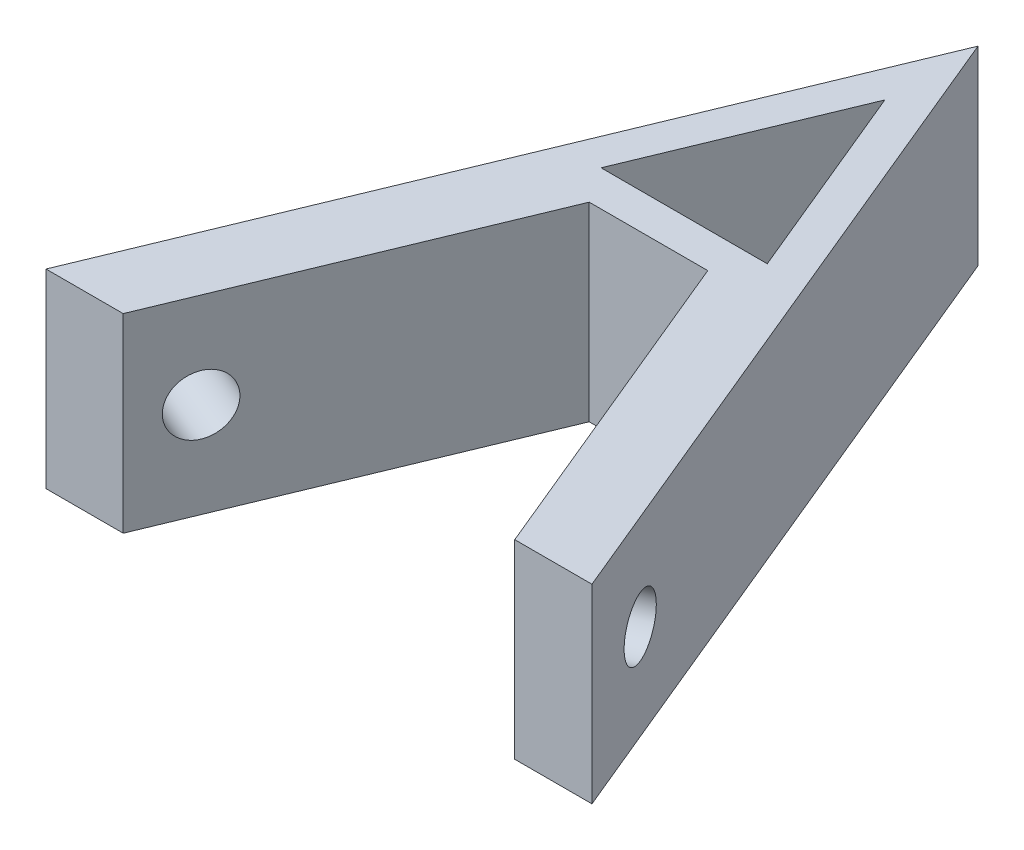
ISO-10303-21;
HEADER;
FILE_DESCRIPTION(('STEP AP214'),'2;1');
FILE_NAME('part.step','',(''),(''),'','','');
FILE_SCHEMA(('AUTOMOTIVE_DESIGN { 1 0 10303 214 1 1 1 1 }'));
ENDSEC;
DATA;
#1=APPLICATION_CONTEXT('core data for automotive mechanical design processes');
#2=APPLICATION_PROTOCOL_DEFINITION('international standard','automotive_design',2000,#1);
#3=PRODUCT_CONTEXT('',#1,'mechanical');
#4=PRODUCT('Part','Part','',(#3));
#5=PRODUCT_RELATED_PRODUCT_CATEGORY('part','',(#4));
#6=PRODUCT_DEFINITION_FORMATION('','',#4);
#7=PRODUCT_DEFINITION_CONTEXT('part definition',#1,'design');
#8=PRODUCT_DEFINITION('design','',#6,#7);
#9=PRODUCT_DEFINITION_SHAPE('','',#8);
#10=(LENGTH_UNIT() NAMED_UNIT(*) SI_UNIT(.MILLI.,.METRE.));
#11=(NAMED_UNIT(*) PLANE_ANGLE_UNIT() SI_UNIT($,.RADIAN.));
#12=(NAMED_UNIT(*) SI_UNIT($,.STERADIAN.) SOLID_ANGLE_UNIT());
#13=UNCERTAINTY_MEASURE_WITH_UNIT(LENGTH_MEASURE(1.E-05),#10,'distance_accuracy_value','');
#14=(GEOMETRIC_REPRESENTATION_CONTEXT(3) GLOBAL_UNCERTAINTY_ASSIGNED_CONTEXT((#13)) GLOBAL_UNIT_ASSIGNED_CONTEXT((#10,
#11,#12)) REPRESENTATION_CONTEXT('',''));
#15=CARTESIAN_POINT('',(0.,0.,0.));
#16=DIRECTION('',(0.,0.,1.));
#17=DIRECTION('',(1.,0.,0.));
#18=AXIS2_PLACEMENT_3D('',#15,#16,#17);
#19=CARTESIAN_POINT('',(-22.9610059419052,16.,55.4327719506773));
#20=DIRECTION('',(0.,0.,-1.));
#21=DIRECTION('',(-1.,0.,0.));
#22=AXIS2_PLACEMENT_3D('',#19,#20,#21);
#23=PLANE('',#22);
#24=DIRECTION('',(1.,0.,0.));
#25=VECTOR('',#24,1.);
#26=CARTESIAN_POINT('',(-22.9610059419052,0.,55.4327719506773));
#27=LINE('',#26,#25);
#28=CARTESIAN_POINT('',(-22.9610059419052,0.,55.4327719506773));
#29=VERTEX_POINT('',#28);
#30=CARTESIAN_POINT('',(-16.4666527401509,0.,55.4327719506773));
#31=VERTEX_POINT('',#30);
#32=EDGE_CURVE('E142',#29,#31,#27,.T.);
#33=ORIENTED_EDGE('',*,*,#32,.T.);
#34=DIRECTION('',(0.,1.,0.));
#35=VECTOR('',#34,1.);
#36=CARTESIAN_POINT('',(-16.4666527401509,0.,55.4327719506773));
#37=LINE('',#36,#35);
#38=CARTESIAN_POINT('',(-16.4666527401509,16.,55.4327719506773));
#39=VERTEX_POINT('',#38);
#40=EDGE_CURVE('E178',#31,#39,#37,.T.);
#41=ORIENTED_EDGE('',*,*,#40,.T.);
#42=DIRECTION('',(1.,0.,0.));
#43=VECTOR('',#42,1.);
#44=CARTESIAN_POINT('',(-22.9610059419052,16.,55.4327719506773));
#45=LINE('',#44,#43);
#46=CARTESIAN_POINT('',(-22.9610059419052,16.,55.4327719506773));
#47=VERTEX_POINT('',#46);
#48=EDGE_CURVE('E152',#47,#39,#45,.T.);
#49=ORIENTED_EDGE('',*,*,#48,.F.);
#50=DIRECTION('',(0.,-1.,0.));
#51=VECTOR('',#50,1.);
#52=CARTESIAN_POINT('',(-22.9610059419052,16.,55.4327719506773));
#53=LINE('',#52,#51);
#54=EDGE_CURVE('E47',#47,#29,#53,.T.);
#55=ORIENTED_EDGE('',*,*,#54,.T.);
#56=EDGE_LOOP('',(#33,#41,#49,#55));
#57=FACE_BOUND('',#56,.T.);
#58=ADVANCED_FACE('F38',(#57),#23,.F.);
#59=CARTESIAN_POINT('',(22.9610059419052,16.,55.4327719506773));
#60=DIRECTION('',(-0.923879532511288,0.,0.382683432365087));
#61=DIRECTION('',(0.382683432365087,0.,0.923879532511288));
#62=AXIS2_PLACEMENT_3D('',#59,#60,#61);
#63=PLANE('',#62);
#64=CARTESIAN_POINT('',(20.0908801991671,8.,48.5036754568426));
#65=DIRECTION('',(0.923879532511288,0.,-0.382683432365087));
#66=DIRECTION('',(-0.382683432365087,0.,-0.923879532511288));
#67=AXIS2_PLACEMENT_3D('',#64,#65,#66);
#68=CIRCLE('',#67,2.5);
#69=CARTESIAN_POINT('',(19.1341716182544,8.,46.1939766255644));
#70=VERTEX_POINT('',#69);
#71=EDGE_CURVE('E157',#70,#70,#68,.T.);
#72=ORIENTED_EDGE('',*,*,#71,.F.);
#73=EDGE_LOOP('',(#72));
#74=FACE_BOUND('',#73,.T.);
#75=DIRECTION('',(-0.382683432365087,0.,-0.923879532511288));
#76=VECTOR('',#75,1.);
#77=CARTESIAN_POINT('',(22.9610059419052,0.,55.4327719506773));
#78=LINE('',#77,#76);
#79=CARTESIAN_POINT('',(22.9610059419052,0.,55.4327719506773));
#80=VERTEX_POINT('',#79);
#81=CARTESIAN_POINT('',(0.,0.,0.));
#82=VERTEX_POINT('',#81);
#83=EDGE_CURVE('E141',#80,#82,#78,.T.);
#84=ORIENTED_EDGE('',*,*,#83,.T.);
#85=DIRECTION('',(0.,-1.,0.));
#86=VECTOR('',#85,1.);
#87=CARTESIAN_POINT('',(0.,16.,0.));
#88=LINE('',#87,#86);
#89=CARTESIAN_POINT('',(0.,16.,0.));
#90=VERTEX_POINT('',#89);
#91=EDGE_CURVE('E11',#90,#82,#88,.T.);
#92=ORIENTED_EDGE('',*,*,#91,.F.);
#93=DIRECTION('',(-0.382683432365087,0.,-0.923879532511288));
#94=VECTOR('',#93,1.);
#95=CARTESIAN_POINT('',(22.9610059419052,16.,55.4327719506773));
#96=LINE('',#95,#94);
#97=CARTESIAN_POINT('',(22.9610059419052,16.,55.4327719506773));
#98=VERTEX_POINT('',#97);
#99=EDGE_CURVE('E146',#98,#90,#96,.T.);
#100=ORIENTED_EDGE('',*,*,#99,.F.);
#101=DIRECTION('',(0.,-1.,0.));
#102=VECTOR('',#101,1.);
#103=CARTESIAN_POINT('',(22.9610059419052,16.,55.4327719506773));
#104=LINE('',#103,#102);
#105=EDGE_CURVE('E150',#98,#80,#104,.T.);
#106=ORIENTED_EDGE('',*,*,#105,.T.);
#107=EDGE_LOOP('',(#84,#92,#100,#106));
#108=FACE_BOUND('',#107,.T.);
#109=ADVANCED_FACE('F40',(#74,#108),#63,.F.);
#110=CARTESIAN_POINT('',(0.,16.,0.));
#111=DIRECTION('',(0.923879532511288,0.,0.382683432365087));
#112=DIRECTION('',(0.382683432365087,0.,-0.923879532511288));
#113=AXIS2_PLACEMENT_3D('',#110,#111,#112);
#114=PLANE('',#113);
#115=CARTESIAN_POINT('',(-20.0908801991671,8.,48.5036754568426));
#116=DIRECTION('',(-0.923879532511288,0.,-0.382683432365087));
#117=DIRECTION('',(-0.382683432365087,0.,0.923879532511288));
#118=AXIS2_PLACEMENT_3D('',#115,#116,#117);
#119=CIRCLE('',#118,2.5);
#120=CARTESIAN_POINT('',(-21.0475887800798,8.,50.8133742881208));
#121=VERTEX_POINT('',#120);
#122=EDGE_CURVE('E167',#121,#121,#119,.T.);
#123=ORIENTED_EDGE('',*,*,#122,.F.);
#124=EDGE_LOOP('',(#123));
#125=FACE_BOUND('',#124,.T.);
#126=DIRECTION('',(-0.382683432365087,0.,0.923879532511288));
#127=VECTOR('',#126,1.);
#128=CARTESIAN_POINT('',(0.,0.,0.));
#129=LINE('',#128,#127);
#130=EDGE_CURVE('E143',#82,#29,#129,.T.);
#131=ORIENTED_EDGE('',*,*,#130,.T.);
#132=ORIENTED_EDGE('',*,*,#54,.F.);
#133=DIRECTION('',(-0.382683432365087,0.,0.923879532511288));
#134=VECTOR('',#133,1.);
#135=CARTESIAN_POINT('',(0.,16.,0.));
#136=LINE('',#135,#134);
#137=EDGE_CURVE('E205',#90,#47,#136,.T.);
#138=ORIENTED_EDGE('',*,*,#137,.F.);
#139=ORIENTED_EDGE('',*,*,#91,.T.);
#140=EDGE_LOOP('',(#131,#132,#138,#139));
#141=FACE_BOUND('',#140,.T.);
#142=ADVANCED_FACE('F224',(#125,#141),#114,.F.);
#143=CARTESIAN_POINT('',(16.4666527401509,16.,55.4327719506773));
#144=VERTEX_POINT('',#143);
#145=EDGE_CURVE('E133',#144,#98,#45,.T.);
#146=ORIENTED_EDGE('',*,*,#145,.F.);
#147=DIRECTION('',(0.,1.,0.));
#148=VECTOR('',#147,1.);
#149=CARTESIAN_POINT('',(16.4666527401509,0.,55.4327719506773));
#150=LINE('',#149,#148);
#151=CARTESIAN_POINT('',(16.4666527401509,0.,55.4327719506773));
#152=VERTEX_POINT('',#151);
#153=EDGE_CURVE('E120',#152,#144,#150,.T.);
#154=ORIENTED_EDGE('',*,*,#153,.F.);
#155=EDGE_CURVE('E131',#152,#80,#27,.T.);
#156=ORIENTED_EDGE('',*,*,#155,.T.);
#157=ORIENTED_EDGE('',*,*,#105,.F.);
#158=EDGE_LOOP('',(#146,#154,#156,#157));
#159=FACE_BOUND('',#158,.T.);
#160=ADVANCED_FACE('F129',(#159),#23,.F.);
#161=CARTESIAN_POINT('',(0.,16.,0.));
#162=DIRECTION('',(0.,-1.,0.));
#163=DIRECTION('',(0.,0.,-1.));
#164=AXIS2_PLACEMENT_3D('',#161,#162,#163);
#165=PLANE('',#164);
#166=DIRECTION('',(1.,0.,0.));
#167=VECTOR('',#166,1.);
#168=CARTESIAN_POINT('',(-6.99068568295617,16.,24.7163859753386));
#169=LINE('',#168,#167);
#170=CARTESIAN_POINT('',(-6.99068568295617,16.,24.7163859753386));
#171=VERTEX_POINT('',#170);
#172=CARTESIAN_POINT('',(6.99068568295616,16.,24.7163859753386));
#173=VERTEX_POINT('',#172);
#174=EDGE_CURVE('E191',#171,#173,#169,.T.);
#175=ORIENTED_EDGE('',*,*,#174,.F.);
#176=DIRECTION('',(-0.382683432365087,0.,0.923879532511288));
#177=VECTOR('',#176,1.);
#178=CARTESIAN_POINT('',(0.,16.,7.83937778925831));
#179=LINE('',#178,#177);
#180=CARTESIAN_POINT('',(0.,16.,7.83937778925831));
#181=VERTEX_POINT('',#180);
#182=EDGE_CURVE('E55',#181,#171,#179,.T.);
#183=ORIENTED_EDGE('',*,*,#182,.F.);
#184=DIRECTION('',(-0.382683432365087,0.,-0.923879532511288));
#185=VECTOR('',#184,1.);
#186=CARTESIAN_POINT('',(6.99068568295616,16.,24.7163859753386));
#187=LINE('',#186,#185);
#188=EDGE_CURVE('E188',#173,#181,#187,.T.);
#189=ORIENTED_EDGE('',*,*,#188,.F.);
#190=EDGE_LOOP('',(#175,#183,#189));
#191=FACE_BOUND('',#190,.T.);
#192=ORIENTED_EDGE('',*,*,#48,.T.);
#193=DIRECTION('',(-0.382683432365087,0.,0.923879532511288));
#194=VECTOR('',#193,1.);
#195=CARTESIAN_POINT('',(-16.4666527401509,16.,55.4327719506773));
#196=LINE('',#195,#194);
#197=CARTESIAN_POINT('',(-4.98614976919826,16.,27.7163859753386));
#198=VERTEX_POINT('',#197);
#199=EDGE_CURVE('E125',#198,#39,#196,.T.);
#200=ORIENTED_EDGE('',*,*,#199,.F.);
#201=DIRECTION('',(-1.,0.,0.));
#202=VECTOR('',#201,1.);
#203=CARTESIAN_POINT('',(4.98614976919825,16.,27.7163859753386));
#204=LINE('',#203,#202);
#205=CARTESIAN_POINT('',(4.98614976919825,16.,27.7163859753386));
#206=VERTEX_POINT('',#205);
#207=EDGE_CURVE('E174',#206,#198,#204,.T.);
#208=ORIENTED_EDGE('',*,*,#207,.F.);
#209=DIRECTION('',(-0.382683432365087,0.,-0.923879532511288));
#210=VECTOR('',#209,1.);
#211=CARTESIAN_POINT('',(16.4666527401509,16.,55.4327719506773));
#212=LINE('',#211,#210);
#213=EDGE_CURVE('E172',#144,#206,#212,.T.);
#214=ORIENTED_EDGE('',*,*,#213,.F.);
#215=ORIENTED_EDGE('',*,*,#145,.T.);
#216=ORIENTED_EDGE('',*,*,#99,.T.);
#217=ORIENTED_EDGE('',*,*,#137,.T.);
#218=EDGE_LOOP('',(#192,#200,#208,#214,#215,#216,#217));
#219=FACE_BOUND('',#218,.T.);
#220=ADVANCED_FACE('F212',(#191,#219),#165,.F.);
#221=CARTESIAN_POINT('',(0.,0.,0.));
#222=DIRECTION('',(0.,-1.,0.));
#223=DIRECTION('',(0.,0.,-1.));
#224=AXIS2_PLACEMENT_3D('',#221,#222,#223);
#225=PLANE('',#224);
#226=DIRECTION('',(-0.382683432365087,0.,0.923879532511288));
#227=VECTOR('',#226,1.);
#228=CARTESIAN_POINT('',(-16.4666527401509,0.,55.4327719506773));
#229=LINE('',#228,#227);
#230=CARTESIAN_POINT('',(-4.98614976919826,0.,27.7163859753386));
#231=VERTEX_POINT('',#230);
#232=EDGE_CURVE('E134',#231,#31,#229,.T.);
#233=ORIENTED_EDGE('',*,*,#232,.T.);
#234=ORIENTED_EDGE('',*,*,#32,.F.);
#235=ORIENTED_EDGE('',*,*,#130,.F.);
#236=ORIENTED_EDGE('',*,*,#83,.F.);
#237=ORIENTED_EDGE('',*,*,#155,.F.);
#238=DIRECTION('',(-0.382683432365087,0.,-0.923879532511288));
#239=VECTOR('',#238,1.);
#240=CARTESIAN_POINT('',(16.4666527401509,0.,55.4327719506773));
#241=LINE('',#240,#239);
#242=CARTESIAN_POINT('',(4.98614976919825,0.,27.7163859753386));
#243=VERTEX_POINT('',#242);
#244=EDGE_CURVE('E116',#152,#243,#241,.T.);
#245=ORIENTED_EDGE('',*,*,#244,.T.);
#246=DIRECTION('',(-1.,0.,0.));
#247=VECTOR('',#246,1.);
#248=CARTESIAN_POINT('',(4.98614976919825,0.,27.7163859753386));
#249=LINE('',#248,#247);
#250=EDGE_CURVE('E63',#243,#231,#249,.T.);
#251=ORIENTED_EDGE('',*,*,#250,.T.);
#252=EDGE_LOOP('',(#233,#234,#235,#236,#237,#245,#251));
#253=FACE_BOUND('',#252,.T.);
#254=DIRECTION('',(-0.382683432365087,0.,0.923879532511288));
#255=VECTOR('',#254,1.);
#256=CARTESIAN_POINT('',(0.,0.,7.83937778925831));
#257=LINE('',#256,#255);
#258=CARTESIAN_POINT('',(0.,0.,7.83937778925831));
#259=VERTEX_POINT('',#258);
#260=CARTESIAN_POINT('',(-6.99068568295617,0.,24.7163859753386));
#261=VERTEX_POINT('',#260);
#262=EDGE_CURVE('E192',#259,#261,#257,.T.);
#263=ORIENTED_EDGE('',*,*,#262,.T.);
#264=DIRECTION('',(1.,0.,0.));
#265=VECTOR('',#264,1.);
#266=CARTESIAN_POINT('',(-6.99068568295617,0.,24.7163859753386));
#267=LINE('',#266,#265);
#268=CARTESIAN_POINT('',(6.99068568295616,0.,24.7163859753386));
#269=VERTEX_POINT('',#268);
#270=EDGE_CURVE('E198',#261,#269,#267,.T.);
#271=ORIENTED_EDGE('',*,*,#270,.T.);
#272=DIRECTION('',(-0.382683432365087,0.,-0.923879532511288));
#273=VECTOR('',#272,1.);
#274=CARTESIAN_POINT('',(6.99068568295616,0.,24.7163859753386));
#275=LINE('',#274,#273);
#276=EDGE_CURVE('E186',#269,#259,#275,.T.);
#277=ORIENTED_EDGE('',*,*,#276,.T.);
#278=EDGE_LOOP('',(#263,#271,#277));
#279=FACE_BOUND('',#278,.T.);
#280=ADVANCED_FACE('F138',(#253,#279),#225,.T.);
#281=CARTESIAN_POINT('',(0.,0.,7.83937778925831));
#282=DIRECTION('',(-0.923879532511288,0.,-0.382683432365087));
#283=DIRECTION('',(-0.382683432365087,0.,0.923879532511288));
#284=AXIS2_PLACEMENT_3D('',#281,#282,#283);
#285=PLANE('',#284);
#286=ORIENTED_EDGE('',*,*,#182,.T.);
#287=DIRECTION('',(0.,1.,0.));
#288=VECTOR('',#287,1.);
#289=CARTESIAN_POINT('',(-6.99068568295617,0.,24.7163859753386));
#290=LINE('',#289,#288);
#291=EDGE_CURVE('E184',#261,#171,#290,.T.);
#292=ORIENTED_EDGE('',*,*,#291,.F.);
#293=ORIENTED_EDGE('',*,*,#262,.F.);
#294=DIRECTION('',(0.,1.,0.));
#295=VECTOR('',#294,1.);
#296=CARTESIAN_POINT('',(0.,0.,7.83937778925831));
#297=LINE('',#296,#295);
#298=EDGE_CURVE('E156',#259,#181,#297,.T.);
#299=ORIENTED_EDGE('',*,*,#298,.T.);
#300=EDGE_LOOP('',(#286,#292,#293,#299));
#301=FACE_BOUND('',#300,.T.);
#302=ADVANCED_FACE('F240',(#301),#285,.F.);
#303=CARTESIAN_POINT('',(6.99068568295616,0.,24.7163859753386));
#304=DIRECTION('',(0.923879532511288,0.,-0.382683432365087));
#305=DIRECTION('',(-0.382683432365087,0.,-0.923879532511288));
#306=AXIS2_PLACEMENT_3D('',#303,#304,#305);
#307=PLANE('',#306);
#308=ORIENTED_EDGE('',*,*,#188,.T.);
#309=ORIENTED_EDGE('',*,*,#298,.F.);
#310=ORIENTED_EDGE('',*,*,#276,.F.);
#311=DIRECTION('',(0.,1.,0.));
#312=VECTOR('',#311,1.);
#313=CARTESIAN_POINT('',(6.99068568295616,0.,24.7163859753386));
#314=LINE('',#313,#312);
#315=EDGE_CURVE('E160',#269,#173,#314,.T.);
#316=ORIENTED_EDGE('',*,*,#315,.T.);
#317=EDGE_LOOP('',(#308,#309,#310,#316));
#318=FACE_BOUND('',#317,.T.);
#319=ADVANCED_FACE('F244',(#318),#307,.F.);
#320=CARTESIAN_POINT('',(-6.99068568295617,0.,24.7163859753386));
#321=DIRECTION('',(0.,0.,1.));
#322=DIRECTION('',(1.,0.,0.));
#323=AXIS2_PLACEMENT_3D('',#320,#321,#322);
#324=PLANE('',#323);
#325=ORIENTED_EDGE('',*,*,#174,.T.);
#326=ORIENTED_EDGE('',*,*,#315,.F.);
#327=ORIENTED_EDGE('',*,*,#270,.F.);
#328=ORIENTED_EDGE('',*,*,#291,.T.);
#329=EDGE_LOOP('',(#325,#326,#327,#328));
#330=FACE_BOUND('',#329,.T.);
#331=ADVANCED_FACE('F247',(#330),#324,.F.);
#332=CARTESIAN_POINT('',(-16.4666527401509,0.,55.4327719506773));
#333=DIRECTION('',(-0.923879532511288,0.,-0.382683432365087));
#334=DIRECTION('',(-0.382683432365087,0.,0.923879532511288));
#335=AXIS2_PLACEMENT_3D('',#332,#333,#334);
#336=PLANE('',#335);
#337=CARTESIAN_POINT('',(-14.5476030040994,8.,50.7997760510331));
#338=DIRECTION('',(-0.923879532511288,0.,-0.382683432365087));
#339=DIRECTION('',(-0.382683432365087,0.,0.923879532511288));
#340=AXIS2_PLACEMENT_3D('',#337,#338,#339);
#341=CIRCLE('',#340,2.5);
#342=CARTESIAN_POINT('',(-15.5043115850121,8.,53.1094748823114));
#343=VERTEX_POINT('',#342);
#344=EDGE_CURVE('E42',#343,#343,#341,.T.);
#345=ORIENTED_EDGE('',*,*,#344,.T.);
#346=EDGE_LOOP('',(#345));
#347=FACE_BOUND('',#346,.T.);
#348=ORIENTED_EDGE('',*,*,#199,.T.);
#349=ORIENTED_EDGE('',*,*,#40,.F.);
#350=ORIENTED_EDGE('',*,*,#232,.F.);
#351=DIRECTION('',(0.,1.,0.));
#352=VECTOR('',#351,1.);
#353=CARTESIAN_POINT('',(-4.98614976919826,0.,27.7163859753386));
#354=LINE('',#353,#352);
#355=EDGE_CURVE('E181',#231,#198,#354,.T.);
#356=ORIENTED_EDGE('',*,*,#355,.T.);
#357=EDGE_LOOP('',(#348,#349,#350,#356));
#358=FACE_BOUND('',#357,.T.);
#359=ADVANCED_FACE('F219',(#347,#358),#336,.F.);
#360=CARTESIAN_POINT('',(4.98614976919825,0.,27.7163859753386));
#361=DIRECTION('',(0.,0.,-1.));
#362=DIRECTION('',(-1.,0.,0.));
#363=AXIS2_PLACEMENT_3D('',#360,#361,#362);
#364=PLANE('',#363);
#365=ORIENTED_EDGE('',*,*,#207,.T.);
#366=ORIENTED_EDGE('',*,*,#355,.F.);
#367=ORIENTED_EDGE('',*,*,#250,.F.);
#368=DIRECTION('',(0.,1.,0.));
#369=VECTOR('',#368,1.);
#370=CARTESIAN_POINT('',(4.98614976919825,0.,27.7163859753386));
#371=LINE('',#370,#369);
#372=EDGE_CURVE('E122',#243,#206,#371,.T.);
#373=ORIENTED_EDGE('',*,*,#372,.T.);
#374=EDGE_LOOP('',(#365,#366,#367,#373));
#375=FACE_BOUND('',#374,.T.);
#376=ADVANCED_FACE('F216',(#375),#364,.F.);
#377=CARTESIAN_POINT('',(16.4666527401509,0.,55.4327719506773));
#378=DIRECTION('',(0.923879532511288,0.,-0.382683432365087));
#379=DIRECTION('',(-0.382683432365087,0.,-0.923879532511288));
#380=AXIS2_PLACEMENT_3D('',#377,#378,#379);
#381=PLANE('',#380);
#382=CARTESIAN_POINT('',(14.5476030040994,8.,50.7997760510331));
#383=DIRECTION('',(0.923879532511288,0.,-0.382683432365087));
#384=DIRECTION('',(-0.382683432365087,0.,-0.923879532511288));
#385=AXIS2_PLACEMENT_3D('',#382,#383,#384);
#386=CIRCLE('',#385,2.5);
#387=CARTESIAN_POINT('',(13.5908944231866,8.,48.4900772197549));
#388=VERTEX_POINT('',#387);
#389=EDGE_CURVE('E154',#388,#388,#386,.T.);
#390=ORIENTED_EDGE('',*,*,#389,.T.);
#391=EDGE_LOOP('',(#390));
#392=FACE_BOUND('',#391,.T.);
#393=ORIENTED_EDGE('',*,*,#213,.T.);
#394=ORIENTED_EDGE('',*,*,#372,.F.);
#395=ORIENTED_EDGE('',*,*,#244,.F.);
#396=ORIENTED_EDGE('',*,*,#153,.T.);
#397=EDGE_LOOP('',(#393,#394,#395,#396));
#398=FACE_BOUND('',#397,.T.);
#399=ADVANCED_FACE('F119',(#392,#398),#381,.F.);
#400=CARTESIAN_POINT('',(5.30880767898648,8.,54.626610374684));
#401=DIRECTION('',(0.923879532511288,0.,-0.382683432365087));
#402=DIRECTION('',(-0.382683432365087,0.,-0.923879532511288));
#403=AXIS2_PLACEMENT_3D('',#400,#401,#402);
#404=CYLINDRICAL_SURFACE('',#403,2.5);
#405=ORIENTED_EDGE('',*,*,#71,.T.);
#406=EDGE_LOOP('',(#405));
#407=FACE_BOUND('',#406,.T.);
#408=ORIENTED_EDGE('',*,*,#389,.F.);
#409=EDGE_LOOP('',(#408));
#410=FACE_BOUND('',#409,.T.);
#411=ADVANCED_FACE('F256',(#407,#410),#404,.F.);
#412=CARTESIAN_POINT('',(-5.30880767898648,8.,54.626610374684));
#413=DIRECTION('',(-0.923879532511288,0.,-0.382683432365087));
#414=DIRECTION('',(-0.382683432365087,0.,0.923879532511288));
#415=AXIS2_PLACEMENT_3D('',#412,#413,#414);
#416=CYLINDRICAL_SURFACE('',#415,2.5);
#417=ORIENTED_EDGE('',*,*,#122,.T.);
#418=EDGE_LOOP('',(#417));
#419=FACE_BOUND('',#418,.T.);
#420=ORIENTED_EDGE('',*,*,#344,.F.);
#421=EDGE_LOOP('',(#420));
#422=FACE_BOUND('',#421,.T.);
#423=ADVANCED_FACE('F264',(#419,#422),#416,.F.);
#424=CLOSED_SHELL('',(#58,#109,#142,#160,#220,#280,#302,#319,#331,#359,#376,#399,#411,#423));
#425=MANIFOLD_SOLID_BREP('B2',#424);
#426=ADVANCED_BREP_SHAPE_REPRESENTATION('',(#18,#425),#14);
#427=SHAPE_DEFINITION_REPRESENTATION(#9,#426);
ENDSEC;
END-ISO-10303-21;
